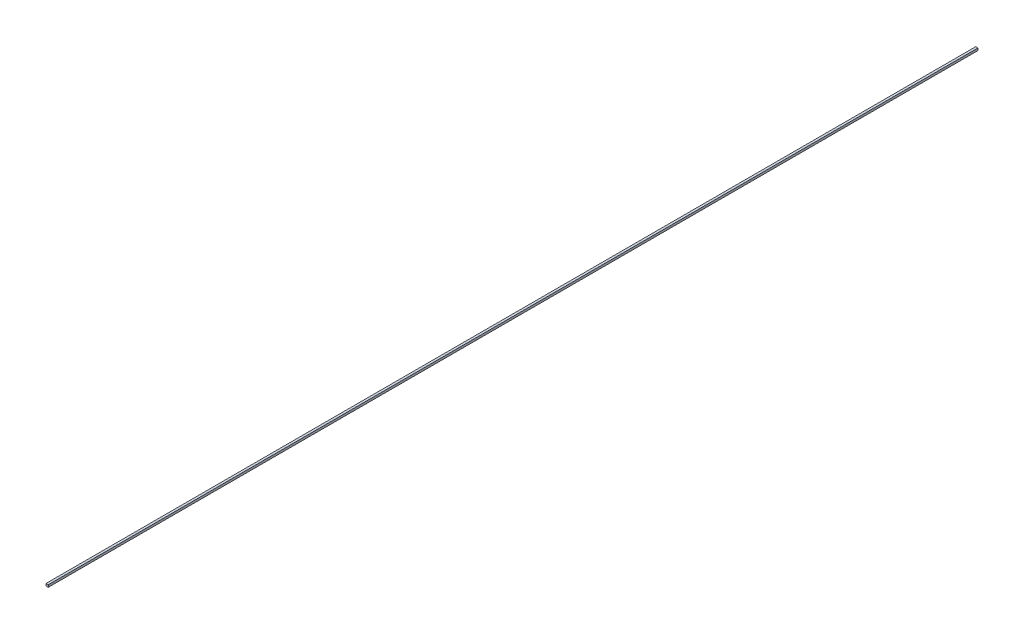
ISO-10303-21;
HEADER;
FILE_DESCRIPTION(('STEP AP214'),'2;1');
FILE_NAME('part.step','',(''),(''),'','','');
FILE_SCHEMA(('AUTOMOTIVE_DESIGN { 1 0 10303 214 1 1 1 1 }'));
ENDSEC;
DATA;
#1=APPLICATION_CONTEXT('core data for automotive mechanical design processes');
#2=APPLICATION_PROTOCOL_DEFINITION('international standard','automotive_design',2000,#1);
#3=PRODUCT_CONTEXT('',#1,'mechanical');
#4=PRODUCT('Part','Part','',(#3));
#5=PRODUCT_RELATED_PRODUCT_CATEGORY('part','',(#4));
#6=PRODUCT_DEFINITION_FORMATION('','',#4);
#7=PRODUCT_DEFINITION_CONTEXT('part definition',#1,'design');
#8=PRODUCT_DEFINITION('design','',#6,#7);
#9=PRODUCT_DEFINITION_SHAPE('','',#8);
#10=(LENGTH_UNIT() NAMED_UNIT(*) SI_UNIT(.MILLI.,.METRE.));
#11=(NAMED_UNIT(*) PLANE_ANGLE_UNIT() SI_UNIT($,.RADIAN.));
#12=(NAMED_UNIT(*) SI_UNIT($,.STERADIAN.) SOLID_ANGLE_UNIT());
#13=UNCERTAINTY_MEASURE_WITH_UNIT(LENGTH_MEASURE(1.E-05),#10,'distance_accuracy_value','');
#14=(GEOMETRIC_REPRESENTATION_CONTEXT(3) GLOBAL_UNCERTAINTY_ASSIGNED_CONTEXT((#13)) GLOBAL_UNIT_ASSIGNED_CONTEXT((#10,
#11,#12)) REPRESENTATION_CONTEXT('',''));
#15=CARTESIAN_POINT('',(0.,0.,0.));
#16=DIRECTION('',(0.,0.,1.));
#17=DIRECTION('',(1.,0.,0.));
#18=AXIS2_PLACEMENT_3D('',#15,#16,#17);
#19=CARTESIAN_POINT('',(-3.,3.,1234.094));
#20=DIRECTION('',(0.,-1.,0.));
#21=DIRECTION('',(0.,0.,-1.));
#22=AXIS2_PLACEMENT_3D('',#19,#20,#21);
#23=PLANE('',#22);
#24=DIRECTION('',(0.,0.,-1.));
#25=VECTOR('',#24,1.);
#26=CARTESIAN_POINT('',(3.,3.,1234.094));
#27=LINE('',#26,#25);
#28=CARTESIAN_POINT('',(3.,3.,1234.094));
#29=VERTEX_POINT('',#28);
#30=CARTESIAN_POINT('',(3.,3.,-1234.094));
#31=VERTEX_POINT('',#30);
#32=EDGE_CURVE('E89',#29,#31,#27,.T.);
#33=ORIENTED_EDGE('',*,*,#32,.T.);
#34=DIRECTION('',(-1.,0.,0.));
#35=VECTOR('',#34,1.);
#36=CARTESIAN_POINT('',(-3.,3.,-1234.094));
#37=LINE('',#36,#35);
#38=CARTESIAN_POINT('',(-3.,3.,-1234.094));
#39=VERTEX_POINT('',#38);
#40=EDGE_CURVE('E85',#31,#39,#37,.T.);
#41=ORIENTED_EDGE('',*,*,#40,.T.);
#42=DIRECTION('',(0.,0.,-1.));
#43=VECTOR('',#42,1.);
#44=CARTESIAN_POINT('',(-3.,3.,1234.094));
#45=LINE('',#44,#43);
#46=CARTESIAN_POINT('',(-3.,3.,1234.094));
#47=VERTEX_POINT('',#46);
#48=EDGE_CURVE('E11',#47,#39,#45,.T.);
#49=ORIENTED_EDGE('',*,*,#48,.F.);
#50=DIRECTION('',(-1.,0.,0.));
#51=VECTOR('',#50,1.);
#52=CARTESIAN_POINT('',(-3.,3.,1234.094));
#53=LINE('',#52,#51);
#54=EDGE_CURVE('E96',#29,#47,#53,.T.);
#55=ORIENTED_EDGE('',*,*,#54,.F.);
#56=EDGE_LOOP('',(#33,#41,#49,#55));
#57=FACE_BOUND('',#56,.T.);
#58=ADVANCED_FACE('F33',(#57),#23,.F.);
#59=CARTESIAN_POINT('',(-3.,-3.,1234.094));
#60=DIRECTION('',(1.,0.,0.));
#61=DIRECTION('',(0.,0.,-1.));
#62=AXIS2_PLACEMENT_3D('',#59,#60,#61);
#63=PLANE('',#62);
#64=ORIENTED_EDGE('',*,*,#48,.T.);
#65=DIRECTION('',(0.,-1.,0.));
#66=VECTOR('',#65,1.);
#67=CARTESIAN_POINT('',(-3.,-3.,-1234.094));
#68=LINE('',#67,#66);
#69=CARTESIAN_POINT('',(-3.,-3.,-1234.094));
#70=VERTEX_POINT('',#69);
#71=EDGE_CURVE('E75',#39,#70,#68,.T.);
#72=ORIENTED_EDGE('',*,*,#71,.T.);
#73=DIRECTION('',(0.,0.,-1.));
#74=VECTOR('',#73,1.);
#75=CARTESIAN_POINT('',(-3.,-3.,1234.094));
#76=LINE('',#75,#74);
#77=CARTESIAN_POINT('',(-3.,-3.,1234.094));
#78=VERTEX_POINT('',#77);
#79=EDGE_CURVE('E40',#78,#70,#76,.T.);
#80=ORIENTED_EDGE('',*,*,#79,.F.);
#81=DIRECTION('',(0.,-1.,0.));
#82=VECTOR('',#81,1.);
#83=CARTESIAN_POINT('',(-3.,-3.,1234.094));
#84=LINE('',#83,#82);
#85=EDGE_CURVE('E76',#47,#78,#84,.T.);
#86=ORIENTED_EDGE('',*,*,#85,.F.);
#87=EDGE_LOOP('',(#64,#72,#80,#86));
#88=FACE_BOUND('',#87,.T.);
#89=ADVANCED_FACE('F73',(#88),#63,.F.);
#90=CARTESIAN_POINT('',(-3.,-3.,1234.094));
#91=DIRECTION('',(0.,1.,0.));
#92=DIRECTION('',(0.,0.,1.));
#93=AXIS2_PLACEMENT_3D('',#90,#91,#92);
#94=PLANE('',#93);
#95=ORIENTED_EDGE('',*,*,#79,.T.);
#96=DIRECTION('',(1.,0.,0.));
#97=VECTOR('',#96,1.);
#98=CARTESIAN_POINT('',(-3.,-3.,-1234.094));
#99=LINE('',#98,#97);
#100=CARTESIAN_POINT('',(3.,-3.,-1234.094));
#101=VERTEX_POINT('',#100);
#102=EDGE_CURVE('E87',#70,#101,#99,.T.);
#103=ORIENTED_EDGE('',*,*,#102,.T.);
#104=DIRECTION('',(0.,0.,-1.));
#105=VECTOR('',#104,1.);
#106=CARTESIAN_POINT('',(3.,-3.,1234.094));
#107=LINE('',#106,#105);
#108=CARTESIAN_POINT('',(3.,-3.,1234.094));
#109=VERTEX_POINT('',#108);
#110=EDGE_CURVE('E102',#109,#101,#107,.T.);
#111=ORIENTED_EDGE('',*,*,#110,.F.);
#112=DIRECTION('',(1.,0.,0.));
#113=VECTOR('',#112,1.);
#114=CARTESIAN_POINT('',(-3.,-3.,1234.094));
#115=LINE('',#114,#113);
#116=EDGE_CURVE('E52',#78,#109,#115,.T.);
#117=ORIENTED_EDGE('',*,*,#116,.F.);
#118=EDGE_LOOP('',(#95,#103,#111,#117));
#119=FACE_BOUND('',#118,.T.);
#120=ADVANCED_FACE('F104',(#119),#94,.F.);
#121=CARTESIAN_POINT('',(3.,-3.,1234.094));
#122=DIRECTION('',(-1.,0.,0.));
#123=DIRECTION('',(0.,0.,1.));
#124=AXIS2_PLACEMENT_3D('',#121,#122,#123);
#125=PLANE('',#124);
#126=ORIENTED_EDGE('',*,*,#110,.T.);
#127=DIRECTION('',(0.,1.,0.));
#128=VECTOR('',#127,1.);
#129=CARTESIAN_POINT('',(3.,-3.,-1234.094));
#130=LINE('',#129,#128);
#131=EDGE_CURVE('E94',#101,#31,#130,.T.);
#132=ORIENTED_EDGE('',*,*,#131,.T.);
#133=ORIENTED_EDGE('',*,*,#32,.F.);
#134=DIRECTION('',(0.,1.,0.));
#135=VECTOR('',#134,1.);
#136=CARTESIAN_POINT('',(3.,-3.,1234.094));
#137=LINE('',#136,#135);
#138=EDGE_CURVE('E47',#109,#29,#137,.T.);
#139=ORIENTED_EDGE('',*,*,#138,.F.);
#140=EDGE_LOOP('',(#126,#132,#133,#139));
#141=FACE_BOUND('',#140,.T.);
#142=ADVANCED_FACE('F106',(#141),#125,.F.);
#143=CARTESIAN_POINT('',(0.,0.,1234.094));
#144=DIRECTION('',(0.,0.,1.));
#145=DIRECTION('',(1.,0.,0.));
#146=AXIS2_PLACEMENT_3D('',#143,#144,#145);
#147=PLANE('',#146);
#148=ORIENTED_EDGE('',*,*,#54,.T.);
#149=ORIENTED_EDGE('',*,*,#85,.T.);
#150=ORIENTED_EDGE('',*,*,#116,.T.);
#151=ORIENTED_EDGE('',*,*,#138,.T.);
#152=EDGE_LOOP('',(#148,#149,#150,#151));
#153=FACE_BOUND('',#152,.T.);
#154=ADVANCED_FACE('F107',(#153),#147,.T.);
#155=CARTESIAN_POINT('',(0.,0.,-1234.094));
#156=DIRECTION('',(0.,0.,-1.));
#157=DIRECTION('',(1.,0.,0.));
#158=AXIS2_PLACEMENT_3D('',#155,#156,#157);
#159=PLANE('',#158);
#160=ORIENTED_EDGE('',*,*,#40,.F.);
#161=ORIENTED_EDGE('',*,*,#131,.F.);
#162=ORIENTED_EDGE('',*,*,#102,.F.);
#163=ORIENTED_EDGE('',*,*,#71,.F.);
#164=EDGE_LOOP('',(#160,#161,#162,#163));
#165=FACE_BOUND('',#164,.T.);
#166=ADVANCED_FACE('F83',(#165),#159,.T.);
#167=CLOSED_SHELL('',(#58,#89,#120,#142,#154,#166));
#168=MANIFOLD_SOLID_BREP('B2',#167);
#169=ADVANCED_BREP_SHAPE_REPRESENTATION('',(#18,#168),#14);
#170=SHAPE_DEFINITION_REPRESENTATION(#9,#169);
ENDSEC;
END-ISO-10303-21;
